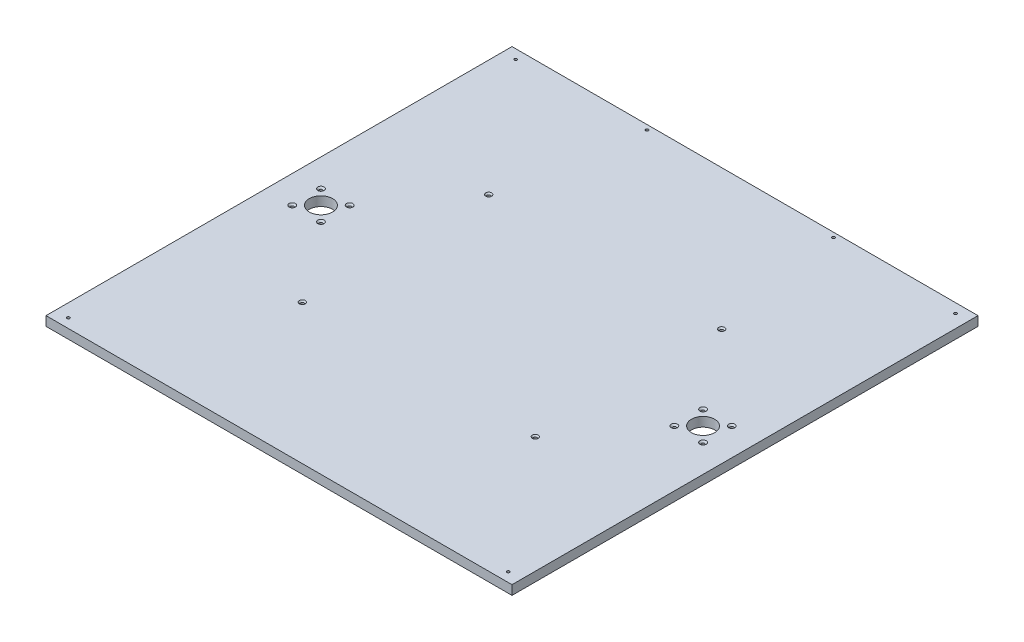
ISO-10303-21;
HEADER;
FILE_DESCRIPTION(('STEP AP214'),'2;1');
FILE_NAME('part.step','',(''),(''),'','','');
FILE_SCHEMA(('AUTOMOTIVE_DESIGN { 1 0 10303 214 1 1 1 1 }'));
ENDSEC;
DATA;
#1=APPLICATION_CONTEXT('core data for automotive mechanical design processes');
#2=APPLICATION_PROTOCOL_DEFINITION('international standard','automotive_design',2000,#1);
#3=PRODUCT_CONTEXT('',#1,'mechanical');
#4=PRODUCT('Part','Part','',(#3));
#5=PRODUCT_RELATED_PRODUCT_CATEGORY('part','',(#4));
#6=PRODUCT_DEFINITION_FORMATION('','',#4);
#7=PRODUCT_DEFINITION_CONTEXT('part definition',#1,'design');
#8=PRODUCT_DEFINITION('design','',#6,#7);
#9=PRODUCT_DEFINITION_SHAPE('','',#8);
#10=(LENGTH_UNIT() NAMED_UNIT(*) SI_UNIT(.MILLI.,.METRE.));
#11=(NAMED_UNIT(*) PLANE_ANGLE_UNIT() SI_UNIT($,.RADIAN.));
#12=(NAMED_UNIT(*) SI_UNIT($,.STERADIAN.) SOLID_ANGLE_UNIT());
#13=UNCERTAINTY_MEASURE_WITH_UNIT(LENGTH_MEASURE(1.E-05),#10,'distance_accuracy_value','');
#14=(GEOMETRIC_REPRESENTATION_CONTEXT(3) GLOBAL_UNCERTAINTY_ASSIGNED_CONTEXT((#13)) GLOBAL_UNIT_ASSIGNED_CONTEXT((#10,
#11,#12)) REPRESENTATION_CONTEXT('',''));
#15=CARTESIAN_POINT('',(0.,0.,0.));
#16=DIRECTION('',(0.,0.,1.));
#17=DIRECTION('',(1.,0.,0.));
#18=AXIS2_PLACEMENT_3D('',#15,#16,#17);
#19=CARTESIAN_POINT('',(0.,10.,0.));
#20=DIRECTION('',(1.,0.,0.));
#21=DIRECTION('',(0.,0.,-1.));
#22=AXIS2_PLACEMENT_3D('',#19,#20,#21);
#23=PLANE('',#22);
#24=DIRECTION('',(0.,0.,1.));
#25=VECTOR('',#24,1.);
#26=CARTESIAN_POINT('',(0.,0.,0.));
#27=LINE('',#26,#25);
#28=CARTESIAN_POINT('',(0.,0.,-500.));
#29=VERTEX_POINT('',#28);
#30=CARTESIAN_POINT('',(0.,0.,0.));
#31=VERTEX_POINT('',#30);
#32=EDGE_CURVE('E106',#29,#31,#27,.T.);
#33=ORIENTED_EDGE('',*,*,#32,.T.);
#34=DIRECTION('',(0.,-1.,0.));
#35=VECTOR('',#34,1.);
#36=CARTESIAN_POINT('',(0.,10.,0.));
#37=LINE('',#36,#35);
#38=CARTESIAN_POINT('',(0.,10.,0.));
#39=VERTEX_POINT('',#38);
#40=EDGE_CURVE('E11',#39,#31,#37,.T.);
#41=ORIENTED_EDGE('',*,*,#40,.F.);
#42=DIRECTION('',(0.,0.,1.));
#43=VECTOR('',#42,1.);
#44=CARTESIAN_POINT('',(0.,10.,0.));
#45=LINE('',#44,#43);
#46=CARTESIAN_POINT('',(0.,10.,-500.));
#47=VERTEX_POINT('',#46);
#48=EDGE_CURVE('E94',#47,#39,#45,.T.);
#49=ORIENTED_EDGE('',*,*,#48,.F.);
#50=DIRECTION('',(0.,-1.,0.));
#51=VECTOR('',#50,1.);
#52=CARTESIAN_POINT('',(0.,10.,-500.));
#53=LINE('',#52,#51);
#54=EDGE_CURVE('E102',#47,#29,#53,.T.);
#55=ORIENTED_EDGE('',*,*,#54,.T.);
#56=EDGE_LOOP('',(#33,#41,#49,#55));
#57=FACE_BOUND('',#56,.T.);
#58=ADVANCED_FACE('F43',(#57),#23,.F.);
#59=CARTESIAN_POINT('',(0.,10.,0.));
#60=DIRECTION('',(0.,0.,-1.));
#61=DIRECTION('',(-1.,0.,0.));
#62=AXIS2_PLACEMENT_3D('',#59,#60,#61);
#63=PLANE('',#62);
#64=DIRECTION('',(1.,0.,0.));
#65=VECTOR('',#64,1.);
#66=CARTESIAN_POINT('',(0.,0.,0.));
#67=LINE('',#66,#65);
#68=CARTESIAN_POINT('',(500.,0.,0.));
#69=VERTEX_POINT('',#68);
#70=EDGE_CURVE('E98',#31,#69,#67,.T.);
#71=ORIENTED_EDGE('',*,*,#70,.T.);
#72=DIRECTION('',(0.,-1.,0.));
#73=VECTOR('',#72,1.);
#74=CARTESIAN_POINT('',(500.,10.,0.));
#75=LINE('',#74,#73);
#76=CARTESIAN_POINT('',(500.,10.,0.));
#77=VERTEX_POINT('',#76);
#78=EDGE_CURVE('E51',#77,#69,#75,.T.);
#79=ORIENTED_EDGE('',*,*,#78,.F.);
#80=DIRECTION('',(1.,0.,0.));
#81=VECTOR('',#80,1.);
#82=CARTESIAN_POINT('',(0.,10.,0.));
#83=LINE('',#82,#81);
#84=EDGE_CURVE('E89',#39,#77,#83,.T.);
#85=ORIENTED_EDGE('',*,*,#84,.F.);
#86=ORIENTED_EDGE('',*,*,#40,.T.);
#87=EDGE_LOOP('',(#71,#79,#85,#86));
#88=FACE_BOUND('',#87,.T.);
#89=ADVANCED_FACE('F97',(#88),#63,.F.);
#90=CARTESIAN_POINT('',(500.,10.,0.));
#91=DIRECTION('',(-1.,0.,0.));
#92=DIRECTION('',(0.,0.,1.));
#93=AXIS2_PLACEMENT_3D('',#90,#91,#92);
#94=PLANE('',#93);
#95=DIRECTION('',(0.,0.,-1.));
#96=VECTOR('',#95,1.);
#97=CARTESIAN_POINT('',(500.,0.,0.));
#98=LINE('',#97,#96);
#99=CARTESIAN_POINT('',(500.,0.,-500.));
#100=VERTEX_POINT('',#99);
#101=EDGE_CURVE('E76',#69,#100,#98,.T.);
#102=ORIENTED_EDGE('',*,*,#101,.T.);
#103=DIRECTION('',(0.,-1.,0.));
#104=VECTOR('',#103,1.);
#105=CARTESIAN_POINT('',(500.,10.,-500.));
#106=LINE('',#105,#104);
#107=CARTESIAN_POINT('',(500.,10.,-500.));
#108=VERTEX_POINT('',#107);
#109=EDGE_CURVE('E99',#108,#100,#106,.T.);
#110=ORIENTED_EDGE('',*,*,#109,.F.);
#111=DIRECTION('',(0.,0.,-1.));
#112=VECTOR('',#111,1.);
#113=CARTESIAN_POINT('',(500.,10.,0.));
#114=LINE('',#113,#112);
#115=EDGE_CURVE('E92',#77,#108,#114,.T.);
#116=ORIENTED_EDGE('',*,*,#115,.F.);
#117=ORIENTED_EDGE('',*,*,#78,.T.);
#118=EDGE_LOOP('',(#102,#110,#116,#117));
#119=FACE_BOUND('',#118,.T.);
#120=ADVANCED_FACE('F100',(#119),#94,.F.);
#121=CARTESIAN_POINT('',(0.,10.,-500.));
#122=DIRECTION('',(0.,0.,1.));
#123=DIRECTION('',(1.,0.,0.));
#124=AXIS2_PLACEMENT_3D('',#121,#122,#123);
#125=PLANE('',#124);
#126=DIRECTION('',(-1.,0.,0.));
#127=VECTOR('',#126,1.);
#128=CARTESIAN_POINT('',(0.,0.,-500.));
#129=LINE('',#128,#127);
#130=EDGE_CURVE('E82',#100,#29,#129,.T.);
#131=ORIENTED_EDGE('',*,*,#130,.T.);
#132=ORIENTED_EDGE('',*,*,#54,.F.);
#133=DIRECTION('',(-1.,0.,0.));
#134=VECTOR('',#133,1.);
#135=CARTESIAN_POINT('',(0.,10.,-500.));
#136=LINE('',#135,#134);
#137=EDGE_CURVE('E59',#108,#47,#136,.T.);
#138=ORIENTED_EDGE('',*,*,#137,.F.);
#139=ORIENTED_EDGE('',*,*,#109,.T.);
#140=EDGE_LOOP('',(#131,#132,#138,#139));
#141=FACE_BOUND('',#140,.T.);
#142=ADVANCED_FACE('F114',(#141),#125,.F.);
#143=CARTESIAN_POINT('',(0.,10.,0.));
#144=DIRECTION('',(0.,-1.,0.));
#145=DIRECTION('',(0.,0.,-1.));
#146=AXIS2_PLACEMENT_3D('',#143,#144,#145);
#147=PLANE('',#146);
#148=CARTESIAN_POINT('',(150.,9.99999999999999,-495.));
#149=DIRECTION('',(0.,-1.,0.));
#150=DIRECTION('',(0.,0.,-1.));
#151=AXIS2_PLACEMENT_3D('',#148,#149,#150);
#152=CIRCLE('',#151,1.5);
#153=CARTESIAN_POINT('',(150.,9.99999999999999,-496.5));
#154=VERTEX_POINT('',#153);
#155=EDGE_CURVE('E269',#154,#154,#152,.T.);
#156=ORIENTED_EDGE('',*,*,#155,.T.);
#157=EDGE_LOOP('',(#156));
#158=FACE_BOUND('',#157,.T.);
#159=CARTESIAN_POINT('',(350.,9.99999999999999,-495.));
#160=DIRECTION('',(0.,-1.,0.));
#161=DIRECTION('',(0.,0.,-1.));
#162=AXIS2_PLACEMENT_3D('',#159,#160,#161);
#163=CIRCLE('',#162,1.5);
#164=CARTESIAN_POINT('',(350.,9.99999999999999,-496.5));
#165=VERTEX_POINT('',#164);
#166=EDGE_CURVE('E263',#165,#165,#163,.T.);
#167=ORIENTED_EDGE('',*,*,#166,.T.);
#168=EDGE_LOOP('',(#167));
#169=FACE_BOUND('',#168,.T.);
#170=CARTESIAN_POINT('',(485.999999999998,10.,-490.));
#171=DIRECTION('',(0.,-1.,0.));
#172=DIRECTION('',(0.,0.,-1.));
#173=AXIS2_PLACEMENT_3D('',#170,#171,#172);
#174=CIRCLE('',#173,1.5);
#175=CARTESIAN_POINT('',(485.999999999998,10.,-491.5));
#176=VERTEX_POINT('',#175);
#177=EDGE_CURVE('E257',#176,#176,#174,.T.);
#178=ORIENTED_EDGE('',*,*,#177,.T.);
#179=EDGE_LOOP('',(#178));
#180=FACE_BOUND('',#179,.T.);
#181=CARTESIAN_POINT('',(485.999999999998,10.,-10.));
#182=DIRECTION('',(0.,-1.,0.));
#183=DIRECTION('',(0.,0.,-1.));
#184=AXIS2_PLACEMENT_3D('',#181,#182,#183);
#185=CIRCLE('',#184,1.5);
#186=CARTESIAN_POINT('',(485.999999999998,10.,-11.5));
#187=VERTEX_POINT('',#186);
#188=EDGE_CURVE('E251',#187,#187,#185,.T.);
#189=ORIENTED_EDGE('',*,*,#188,.T.);
#190=EDGE_LOOP('',(#189));
#191=FACE_BOUND('',#190,.T.);
#192=CARTESIAN_POINT('',(14.0000000000014,10.,-10.));
#193=DIRECTION('',(0.,-1.,0.));
#194=DIRECTION('',(0.,0.,-1.));
#195=AXIS2_PLACEMENT_3D('',#192,#193,#194);
#196=CIRCLE('',#195,1.5);
#197=CARTESIAN_POINT('',(14.0000000000014,10.,-11.5));
#198=VERTEX_POINT('',#197);
#199=EDGE_CURVE('E245',#198,#198,#196,.T.);
#200=ORIENTED_EDGE('',*,*,#199,.T.);
#201=EDGE_LOOP('',(#200));
#202=FACE_BOUND('',#201,.T.);
#203=CARTESIAN_POINT('',(14.0000000000014,10.,-490.));
#204=DIRECTION('',(0.,-1.,0.));
#205=DIRECTION('',(0.,0.,-1.));
#206=AXIS2_PLACEMENT_3D('',#203,#204,#205);
#207=CIRCLE('',#206,1.5);
#208=CARTESIAN_POINT('',(14.0000000000014,10.,-491.5));
#209=VERTEX_POINT('',#208);
#210=EDGE_CURVE('E239',#209,#209,#207,.T.);
#211=ORIENTED_EDGE('',*,*,#210,.T.);
#212=EDGE_LOOP('',(#211));
#213=FACE_BOUND('',#212,.T.);
#214=CARTESIAN_POINT('',(374.999999999999,10.,-350.));
#215=DIRECTION('',(0.,1.,0.));
#216=DIRECTION('',(0.,0.,1.));
#217=AXIS2_PLACEMENT_3D('',#214,#215,#216);
#218=CIRCLE('',#217,3.14999999999999);
#219=CARTESIAN_POINT('',(374.999999999999,10.,-346.85));
#220=VERTEX_POINT('',#219);
#221=EDGE_CURVE('E236',#220,#220,#218,.T.);
#222=ORIENTED_EDGE('',*,*,#221,.F.);
#223=EDGE_LOOP('',(#222));
#224=FACE_BOUND('',#223,.T.);
#225=CARTESIAN_POINT('',(375.,10.,-150.));
#226=DIRECTION('',(0.,1.,0.));
#227=DIRECTION('',(0.,0.,1.));
#228=AXIS2_PLACEMENT_3D('',#225,#226,#227);
#229=CIRCLE('',#228,3.14999999999999);
#230=CARTESIAN_POINT('',(375.,10.,-146.85));
#231=VERTEX_POINT('',#230);
#232=EDGE_CURVE('E227',#231,#231,#229,.T.);
#233=ORIENTED_EDGE('',*,*,#232,.F.);
#234=EDGE_LOOP('',(#233));
#235=FACE_BOUND('',#234,.T.);
#236=CARTESIAN_POINT('',(124.999999999999,10.,-350.));
#237=DIRECTION('',(0.,1.,0.));
#238=DIRECTION('',(0.,0.,1.));
#239=AXIS2_PLACEMENT_3D('',#236,#237,#238);
#240=CIRCLE('',#239,3.15);
#241=CARTESIAN_POINT('',(124.999999999999,10.,-346.85));
#242=VERTEX_POINT('',#241);
#243=EDGE_CURVE('E218',#242,#242,#240,.T.);
#244=ORIENTED_EDGE('',*,*,#243,.F.);
#245=EDGE_LOOP('',(#244));
#246=FACE_BOUND('',#245,.T.);
#247=CARTESIAN_POINT('',(125.,10.,-150.));
#248=DIRECTION('',(0.,1.,0.));
#249=DIRECTION('',(0.,0.,1.));
#250=AXIS2_PLACEMENT_3D('',#247,#248,#249);
#251=CIRCLE('',#250,3.14999999999999);
#252=CARTESIAN_POINT('',(125.,10.,-146.85));
#253=VERTEX_POINT('',#252);
#254=EDGE_CURVE('E209',#253,#253,#251,.T.);
#255=ORIENTED_EDGE('',*,*,#254,.F.);
#256=EDGE_LOOP('',(#255));
#257=FACE_BOUND('',#256,.T.);
#258=CARTESIAN_POINT('',(439.6,10.,-265.4));
#259=DIRECTION('',(0.,1.,0.));
#260=DIRECTION('',(0.,0.,1.));
#261=AXIS2_PLACEMENT_3D('',#258,#259,#260);
#262=CIRCLE('',#261,3.35999999999997);
#263=CARTESIAN_POINT('',(439.6,10.,-262.04));
#264=VERTEX_POINT('',#263);
#265=EDGE_CURVE('E200',#264,#264,#262,.T.);
#266=ORIENTED_EDGE('',*,*,#265,.F.);
#267=EDGE_LOOP('',(#266));
#268=FACE_BOUND('',#267,.T.);
#269=CARTESIAN_POINT('',(439.6,10.,-234.6));
#270=DIRECTION('',(0.,1.,0.));
#271=DIRECTION('',(0.,0.,1.));
#272=AXIS2_PLACEMENT_3D('',#269,#270,#271);
#273=CIRCLE('',#272,3.35999999999997);
#274=CARTESIAN_POINT('',(439.6,10.,-231.24));
#275=VERTEX_POINT('',#274);
#276=EDGE_CURVE('E191',#275,#275,#273,.T.);
#277=ORIENTED_EDGE('',*,*,#276,.F.);
#278=EDGE_LOOP('',(#277));
#279=FACE_BOUND('',#278,.T.);
#280=CARTESIAN_POINT('',(470.4,10.,-234.6));
#281=DIRECTION('',(0.,1.,0.));
#282=DIRECTION('',(0.,0.,1.));
#283=AXIS2_PLACEMENT_3D('',#280,#281,#282);
#284=CIRCLE('',#283,3.35999999999997);
#285=CARTESIAN_POINT('',(470.4,10.,-231.24));
#286=VERTEX_POINT('',#285);
#287=EDGE_CURVE('E182',#286,#286,#284,.T.);
#288=ORIENTED_EDGE('',*,*,#287,.F.);
#289=EDGE_LOOP('',(#288));
#290=FACE_BOUND('',#289,.T.);
#291=CARTESIAN_POINT('',(470.4,10.,-265.4));
#292=DIRECTION('',(0.,1.,0.));
#293=DIRECTION('',(0.,0.,1.));
#294=AXIS2_PLACEMENT_3D('',#291,#292,#293);
#295=CIRCLE('',#294,3.35999999999997);
#296=CARTESIAN_POINT('',(470.4,10.,-262.04));
#297=VERTEX_POINT('',#296);
#298=EDGE_CURVE('E173',#297,#297,#295,.T.);
#299=ORIENTED_EDGE('',*,*,#298,.F.);
#300=EDGE_LOOP('',(#299));
#301=FACE_BOUND('',#300,.T.);
#302=CARTESIAN_POINT('',(60.4,10.,-234.6));
#303=DIRECTION('',(0.,1.,0.));
#304=DIRECTION('',(0.,0.,1.));
#305=AXIS2_PLACEMENT_3D('',#302,#303,#304);
#306=CIRCLE('',#305,3.36);
#307=CARTESIAN_POINT('',(60.4,10.,-231.24));
#308=VERTEX_POINT('',#307);
#309=EDGE_CURVE('E164',#308,#308,#306,.T.);
#310=ORIENTED_EDGE('',*,*,#309,.F.);
#311=EDGE_LOOP('',(#310));
#312=FACE_BOUND('',#311,.T.);
#313=CARTESIAN_POINT('',(60.4,10.,-265.4));
#314=DIRECTION('',(0.,1.,0.));
#315=DIRECTION('',(0.,0.,1.));
#316=AXIS2_PLACEMENT_3D('',#313,#314,#315);
#317=CIRCLE('',#316,3.36);
#318=CARTESIAN_POINT('',(60.4,10.,-262.04));
#319=VERTEX_POINT('',#318);
#320=EDGE_CURVE('E155',#319,#319,#317,.T.);
#321=ORIENTED_EDGE('',*,*,#320,.F.);
#322=EDGE_LOOP('',(#321));
#323=FACE_BOUND('',#322,.T.);
#324=CARTESIAN_POINT('',(29.6,10.,-234.6));
#325=DIRECTION('',(0.,1.,0.));
#326=DIRECTION('',(0.,0.,1.));
#327=AXIS2_PLACEMENT_3D('',#324,#325,#326);
#328=CIRCLE('',#327,3.36);
#329=CARTESIAN_POINT('',(29.6,10.,-231.24));
#330=VERTEX_POINT('',#329);
#331=EDGE_CURVE('E146',#330,#330,#328,.T.);
#332=ORIENTED_EDGE('',*,*,#331,.F.);
#333=EDGE_LOOP('',(#332));
#334=FACE_BOUND('',#333,.T.);
#335=CARTESIAN_POINT('',(29.6,10.,-265.4));
#336=DIRECTION('',(0.,1.,0.));
#337=DIRECTION('',(0.,0.,1.));
#338=AXIS2_PLACEMENT_3D('',#335,#336,#337);
#339=CIRCLE('',#338,3.36);
#340=CARTESIAN_POINT('',(29.6,10.,-262.04));
#341=VERTEX_POINT('',#340);
#342=EDGE_CURVE('E137',#341,#341,#339,.T.);
#343=ORIENTED_EDGE('',*,*,#342,.F.);
#344=EDGE_LOOP('',(#343));
#345=FACE_BOUND('',#344,.T.);
#346=CARTESIAN_POINT('',(45.,10.,-250.));
#347=DIRECTION('',(0.,1.,0.));
#348=DIRECTION('',(0.,0.,1.));
#349=AXIS2_PLACEMENT_3D('',#346,#347,#348);
#350=CIRCLE('',#349,12.5);
#351=CARTESIAN_POINT('',(45.,10.,-237.5));
#352=VERTEX_POINT('',#351);
#353=EDGE_CURVE('E127',#352,#352,#350,.T.);
#354=ORIENTED_EDGE('',*,*,#353,.F.);
#355=EDGE_LOOP('',(#354));
#356=FACE_BOUND('',#355,.T.);
#357=CARTESIAN_POINT('',(455.,10.,-250.));
#358=DIRECTION('',(0.,1.,0.));
#359=DIRECTION('',(0.,0.,1.));
#360=AXIS2_PLACEMENT_3D('',#357,#358,#359);
#361=CIRCLE('',#360,12.5);
#362=CARTESIAN_POINT('',(455.,10.,-237.5));
#363=VERTEX_POINT('',#362);
#364=EDGE_CURVE('E120',#363,#363,#361,.T.);
#365=ORIENTED_EDGE('',*,*,#364,.F.);
#366=EDGE_LOOP('',(#365));
#367=FACE_BOUND('',#366,.T.);
#368=ORIENTED_EDGE('',*,*,#48,.T.);
#369=ORIENTED_EDGE('',*,*,#84,.T.);
#370=ORIENTED_EDGE('',*,*,#115,.T.);
#371=ORIENTED_EDGE('',*,*,#137,.T.);
#372=EDGE_LOOP('',(#368,#369,#370,#371));
#373=FACE_BOUND('',#372,.T.);
#374=ADVANCED_FACE('F90',(#158,#169,#180,#191,#202,#213,#224,#235,#246,#257,#268,#279,#290,#301,
#312,#323,#334,#345,#356,#367,#373),#147,.F.);
#375=CARTESIAN_POINT('',(0.,0.,0.));
#376=DIRECTION('',(0.,-1.,0.));
#377=DIRECTION('',(0.,0.,-1.));
#378=AXIS2_PLACEMENT_3D('',#375,#376,#377);
#379=PLANE('',#378);
#380=CARTESIAN_POINT('',(150.,0.,-495.));
#381=DIRECTION('',(0.,-1.,0.));
#382=DIRECTION('',(0.,0.,-1.));
#383=AXIS2_PLACEMENT_3D('',#380,#381,#382);
#384=CIRCLE('',#383,1.5);
#385=CARTESIAN_POINT('',(150.,0.,-496.5));
#386=VERTEX_POINT('',#385);
#387=EDGE_CURVE('E272',#386,#386,#384,.T.);
#388=ORIENTED_EDGE('',*,*,#387,.F.);
#389=EDGE_LOOP('',(#388));
#390=FACE_BOUND('',#389,.T.);
#391=CARTESIAN_POINT('',(350.,0.,-495.));
#392=DIRECTION('',(0.,-1.,0.));
#393=DIRECTION('',(0.,0.,-1.));
#394=AXIS2_PLACEMENT_3D('',#391,#392,#393);
#395=CIRCLE('',#394,1.5);
#396=CARTESIAN_POINT('',(350.,0.,-496.5));
#397=VERTEX_POINT('',#396);
#398=EDGE_CURVE('E266',#397,#397,#395,.T.);
#399=ORIENTED_EDGE('',*,*,#398,.F.);
#400=EDGE_LOOP('',(#399));
#401=FACE_BOUND('',#400,.T.);
#402=CARTESIAN_POINT('',(485.999999999998,0.,-490.));
#403=DIRECTION('',(0.,-1.,0.));
#404=DIRECTION('',(0.,0.,-1.));
#405=AXIS2_PLACEMENT_3D('',#402,#403,#404);
#406=CIRCLE('',#405,1.5);
#407=CARTESIAN_POINT('',(485.999999999998,0.,-491.5));
#408=VERTEX_POINT('',#407);
#409=EDGE_CURVE('E260',#408,#408,#406,.T.);
#410=ORIENTED_EDGE('',*,*,#409,.F.);
#411=EDGE_LOOP('',(#410));
#412=FACE_BOUND('',#411,.T.);
#413=CARTESIAN_POINT('',(485.999999999998,0.,-10.));
#414=DIRECTION('',(0.,-1.,0.));
#415=DIRECTION('',(0.,0.,-1.));
#416=AXIS2_PLACEMENT_3D('',#413,#414,#415);
#417=CIRCLE('',#416,1.5);
#418=CARTESIAN_POINT('',(485.999999999998,0.,-11.5));
#419=VERTEX_POINT('',#418);
#420=EDGE_CURVE('E254',#419,#419,#417,.T.);
#421=ORIENTED_EDGE('',*,*,#420,.F.);
#422=EDGE_LOOP('',(#421));
#423=FACE_BOUND('',#422,.T.);
#424=CARTESIAN_POINT('',(14.0000000000014,0.,-10.));
#425=DIRECTION('',(0.,-1.,0.));
#426=DIRECTION('',(0.,0.,-1.));
#427=AXIS2_PLACEMENT_3D('',#424,#425,#426);
#428=CIRCLE('',#427,1.5);
#429=CARTESIAN_POINT('',(14.0000000000014,0.,-11.5));
#430=VERTEX_POINT('',#429);
#431=EDGE_CURVE('E248',#430,#430,#428,.T.);
#432=ORIENTED_EDGE('',*,*,#431,.F.);
#433=EDGE_LOOP('',(#432));
#434=FACE_BOUND('',#433,.T.);
#435=CARTESIAN_POINT('',(14.0000000000014,0.,-490.));
#436=DIRECTION('',(0.,-1.,0.));
#437=DIRECTION('',(0.,0.,-1.));
#438=AXIS2_PLACEMENT_3D('',#435,#436,#437);
#439=CIRCLE('',#438,1.5);
#440=CARTESIAN_POINT('',(14.0000000000014,0.,-491.5));
#441=VERTEX_POINT('',#440);
#442=EDGE_CURVE('E242',#441,#441,#439,.T.);
#443=ORIENTED_EDGE('',*,*,#442,.F.);
#444=EDGE_LOOP('',(#443));
#445=FACE_BOUND('',#444,.T.);
#446=CARTESIAN_POINT('',(374.999999999999,0.,-350.));
#447=DIRECTION('',(0.,1.,0.));
#448=DIRECTION('',(0.,0.,1.));
#449=AXIS2_PLACEMENT_3D('',#446,#447,#448);
#450=CIRCLE('',#449,1.69999999999998);
#451=CARTESIAN_POINT('',(374.999999999999,0.,-348.3));
#452=VERTEX_POINT('',#451);
#453=EDGE_CURVE('E230',#452,#452,#450,.T.);
#454=ORIENTED_EDGE('',*,*,#453,.T.);
#455=EDGE_LOOP('',(#454));
#456=FACE_BOUND('',#455,.T.);
#457=CARTESIAN_POINT('',(375.,0.,-150.));
#458=DIRECTION('',(0.,1.,0.));
#459=DIRECTION('',(0.,0.,1.));
#460=AXIS2_PLACEMENT_3D('',#457,#458,#459);
#461=CIRCLE('',#460,1.69999999999998);
#462=CARTESIAN_POINT('',(375.,0.,-148.3));
#463=VERTEX_POINT('',#462);
#464=EDGE_CURVE('E221',#463,#463,#461,.T.);
#465=ORIENTED_EDGE('',*,*,#464,.T.);
#466=EDGE_LOOP('',(#465));
#467=FACE_BOUND('',#466,.T.);
#468=CARTESIAN_POINT('',(124.999999999999,0.,-350.));
#469=DIRECTION('',(0.,1.,0.));
#470=DIRECTION('',(0.,0.,1.));
#471=AXIS2_PLACEMENT_3D('',#468,#469,#470);
#472=CIRCLE('',#471,1.69999999999999);
#473=CARTESIAN_POINT('',(124.999999999999,0.,-348.3));
#474=VERTEX_POINT('',#473);
#475=EDGE_CURVE('E212',#474,#474,#472,.T.);
#476=ORIENTED_EDGE('',*,*,#475,.T.);
#477=EDGE_LOOP('',(#476));
#478=FACE_BOUND('',#477,.T.);
#479=CARTESIAN_POINT('',(125.,0.,-150.));
#480=DIRECTION('',(0.,1.,0.));
#481=DIRECTION('',(0.,0.,1.));
#482=AXIS2_PLACEMENT_3D('',#479,#480,#481);
#483=CIRCLE('',#482,1.70000000000001);
#484=CARTESIAN_POINT('',(125.,0.,-148.3));
#485=VERTEX_POINT('',#484);
#486=EDGE_CURVE('E203',#485,#485,#483,.T.);
#487=ORIENTED_EDGE('',*,*,#486,.T.);
#488=EDGE_LOOP('',(#487));
#489=FACE_BOUND('',#488,.T.);
#490=CARTESIAN_POINT('',(439.6,0.,-265.4));
#491=DIRECTION('',(0.,1.,0.));
#492=DIRECTION('',(0.,0.,1.));
#493=AXIS2_PLACEMENT_3D('',#490,#491,#492);
#494=CIRCLE('',#493,1.69999999999998);
#495=CARTESIAN_POINT('',(439.6,0.,-263.7));
#496=VERTEX_POINT('',#495);
#497=EDGE_CURVE('E194',#496,#496,#494,.T.);
#498=ORIENTED_EDGE('',*,*,#497,.T.);
#499=EDGE_LOOP('',(#498));
#500=FACE_BOUND('',#499,.T.);
#501=CARTESIAN_POINT('',(439.6,0.,-234.6));
#502=DIRECTION('',(0.,1.,0.));
#503=DIRECTION('',(0.,0.,1.));
#504=AXIS2_PLACEMENT_3D('',#501,#502,#503);
#505=CIRCLE('',#504,1.69999999999998);
#506=CARTESIAN_POINT('',(439.6,0.,-232.9));
#507=VERTEX_POINT('',#506);
#508=EDGE_CURVE('E185',#507,#507,#505,.T.);
#509=ORIENTED_EDGE('',*,*,#508,.T.);
#510=EDGE_LOOP('',(#509));
#511=FACE_BOUND('',#510,.T.);
#512=CARTESIAN_POINT('',(470.4,0.,-234.6));
#513=DIRECTION('',(0.,1.,0.));
#514=DIRECTION('',(0.,0.,1.));
#515=AXIS2_PLACEMENT_3D('',#512,#513,#514);
#516=CIRCLE('',#515,1.69999999999998);
#517=CARTESIAN_POINT('',(470.4,0.,-232.9));
#518=VERTEX_POINT('',#517);
#519=EDGE_CURVE('E176',#518,#518,#516,.T.);
#520=ORIENTED_EDGE('',*,*,#519,.T.);
#521=EDGE_LOOP('',(#520));
#522=FACE_BOUND('',#521,.T.);
#523=CARTESIAN_POINT('',(470.4,0.,-265.4));
#524=DIRECTION('',(0.,1.,0.));
#525=DIRECTION('',(0.,0.,1.));
#526=AXIS2_PLACEMENT_3D('',#523,#524,#525);
#527=CIRCLE('',#526,1.69999999999998);
#528=CARTESIAN_POINT('',(470.4,0.,-263.7));
#529=VERTEX_POINT('',#528);
#530=EDGE_CURVE('E167',#529,#529,#527,.T.);
#531=ORIENTED_EDGE('',*,*,#530,.T.);
#532=EDGE_LOOP('',(#531));
#533=FACE_BOUND('',#532,.T.);
#534=CARTESIAN_POINT('',(60.4,0.,-234.6));
#535=DIRECTION('',(0.,1.,0.));
#536=DIRECTION('',(0.,0.,1.));
#537=AXIS2_PLACEMENT_3D('',#534,#535,#536);
#538=CIRCLE('',#537,1.7);
#539=CARTESIAN_POINT('',(60.4,0.,-232.9));
#540=VERTEX_POINT('',#539);
#541=EDGE_CURVE('E158',#540,#540,#538,.T.);
#542=ORIENTED_EDGE('',*,*,#541,.T.);
#543=EDGE_LOOP('',(#542));
#544=FACE_BOUND('',#543,.T.);
#545=CARTESIAN_POINT('',(60.4,0.,-265.4));
#546=DIRECTION('',(0.,1.,0.));
#547=DIRECTION('',(0.,0.,1.));
#548=AXIS2_PLACEMENT_3D('',#545,#546,#547);
#549=CIRCLE('',#548,1.7);
#550=CARTESIAN_POINT('',(60.4,0.,-263.7));
#551=VERTEX_POINT('',#550);
#552=EDGE_CURVE('E149',#551,#551,#549,.T.);
#553=ORIENTED_EDGE('',*,*,#552,.T.);
#554=EDGE_LOOP('',(#553));
#555=FACE_BOUND('',#554,.T.);
#556=CARTESIAN_POINT('',(29.6,0.,-234.6));
#557=DIRECTION('',(0.,1.,0.));
#558=DIRECTION('',(0.,0.,1.));
#559=AXIS2_PLACEMENT_3D('',#556,#557,#558);
#560=CIRCLE('',#559,1.7);
#561=CARTESIAN_POINT('',(29.6,0.,-232.9));
#562=VERTEX_POINT('',#561);
#563=EDGE_CURVE('E140',#562,#562,#560,.T.);
#564=ORIENTED_EDGE('',*,*,#563,.T.);
#565=EDGE_LOOP('',(#564));
#566=FACE_BOUND('',#565,.T.);
#567=CARTESIAN_POINT('',(29.6,0.,-265.4));
#568=DIRECTION('',(0.,1.,0.));
#569=DIRECTION('',(0.,0.,1.));
#570=AXIS2_PLACEMENT_3D('',#567,#568,#569);
#571=CIRCLE('',#570,1.7);
#572=CARTESIAN_POINT('',(29.6,0.,-263.7));
#573=VERTEX_POINT('',#572);
#574=EDGE_CURVE('E124',#573,#573,#571,.T.);
#575=ORIENTED_EDGE('',*,*,#574,.T.);
#576=EDGE_LOOP('',(#575));
#577=FACE_BOUND('',#576,.T.);
#578=CARTESIAN_POINT('',(45.,0.,-250.));
#579=DIRECTION('',(0.,1.,0.));
#580=DIRECTION('',(0.,0.,1.));
#581=AXIS2_PLACEMENT_3D('',#578,#579,#580);
#582=CIRCLE('',#581,12.5);
#583=CARTESIAN_POINT('',(45.,0.,-237.5));
#584=VERTEX_POINT('',#583);
#585=EDGE_CURVE('E109',#584,#584,#582,.T.);
#586=ORIENTED_EDGE('',*,*,#585,.T.);
#587=EDGE_LOOP('',(#586));
#588=FACE_BOUND('',#587,.T.);
#589=CARTESIAN_POINT('',(455.,0.,-250.));
#590=DIRECTION('',(0.,1.,0.));
#591=DIRECTION('',(0.,0.,1.));
#592=AXIS2_PLACEMENT_3D('',#589,#590,#591);
#593=CIRCLE('',#592,12.5);
#594=CARTESIAN_POINT('',(455.,0.,-237.5));
#595=VERTEX_POINT('',#594);
#596=EDGE_CURVE('E123',#595,#595,#593,.T.);
#597=ORIENTED_EDGE('',*,*,#596,.T.);
#598=EDGE_LOOP('',(#597));
#599=FACE_BOUND('',#598,.T.);
#600=ORIENTED_EDGE('',*,*,#32,.F.);
#601=ORIENTED_EDGE('',*,*,#130,.F.);
#602=ORIENTED_EDGE('',*,*,#101,.F.);
#603=ORIENTED_EDGE('',*,*,#70,.F.);
#604=EDGE_LOOP('',(#600,#601,#602,#603));
#605=FACE_BOUND('',#604,.T.);
#606=ADVANCED_FACE('F117',(#390,#401,#412,#423,#434,#445,#456,#467,#478,#489,#500,#511,#522,
#533,#544,#555,#566,#577,#588,#599,#605),#379,.T.);
#607=CARTESIAN_POINT('',(455.,0.,-250.));
#608=DIRECTION('',(0.,1.,0.));
#609=DIRECTION('',(0.,0.,1.));
#610=AXIS2_PLACEMENT_3D('',#607,#608,#609);
#611=CYLINDRICAL_SURFACE('',#610,12.5);
#612=ORIENTED_EDGE('',*,*,#596,.F.);
#613=EDGE_LOOP('',(#612));
#614=FACE_BOUND('',#613,.T.);
#615=ORIENTED_EDGE('',*,*,#364,.T.);
#616=EDGE_LOOP('',(#615));
#617=FACE_BOUND('',#616,.T.);
#618=ADVANCED_FACE('F280',(#614,#617),#611,.F.);
#619=CARTESIAN_POINT('',(45.,0.,-250.));
#620=DIRECTION('',(0.,1.,0.));
#621=DIRECTION('',(0.,0.,1.));
#622=AXIS2_PLACEMENT_3D('',#619,#620,#621);
#623=CYLINDRICAL_SURFACE('',#622,12.5);
#624=ORIENTED_EDGE('',*,*,#585,.F.);
#625=EDGE_LOOP('',(#624));
#626=FACE_BOUND('',#625,.T.);
#627=ORIENTED_EDGE('',*,*,#353,.T.);
#628=EDGE_LOOP('',(#627));
#629=FACE_BOUND('',#628,.T.);
#630=ADVANCED_FACE('F322',(#626,#629),#623,.F.);
#631=CARTESIAN_POINT('',(29.6,10.,-265.4));
#632=DIRECTION('',(0.,1.,0.));
#633=DIRECTION('',(0.,0.,1.));
#634=AXIS2_PLACEMENT_3D('',#631,#632,#633);
#635=CYLINDRICAL_SURFACE('',#634,1.7);
#636=ORIENTED_EDGE('',*,*,#574,.F.);
#637=EDGE_LOOP('',(#636));
#638=FACE_BOUND('',#637,.T.);
#639=CARTESIAN_POINT('',(29.6,8.34,-265.4));
#640=DIRECTION('',(0.,1.,0.));
#641=DIRECTION('',(0.,0.,1.));
#642=AXIS2_PLACEMENT_3D('',#639,#640,#641);
#643=CIRCLE('',#642,1.7);
#644=CARTESIAN_POINT('',(29.6,8.34,-263.7));
#645=VERTEX_POINT('',#644);
#646=EDGE_CURVE('E134',#645,#645,#643,.T.);
#647=ORIENTED_EDGE('',*,*,#646,.T.);
#648=EDGE_LOOP('',(#647));
#649=FACE_BOUND('',#648,.T.);
#650=ADVANCED_FACE('F370',(#638,#649),#635,.F.);
#651=CARTESIAN_POINT('',(29.6,10.,-265.4));
#652=DIRECTION('',(0.,1.,0.));
#653=DIRECTION('',(0.,0.,1.));
#654=AXIS2_PLACEMENT_3D('',#651,#652,#653);
#655=CONICAL_SURFACE('',#654,3.36,0.785398163397449);
#656=ORIENTED_EDGE('',*,*,#646,.F.);
#657=EDGE_LOOP('',(#656));
#658=FACE_BOUND('',#657,.T.);
#659=ORIENTED_EDGE('',*,*,#342,.T.);
#660=EDGE_LOOP('',(#659));
#661=FACE_BOUND('',#660,.T.);
#662=ADVANCED_FACE('F378',(#658,#661),#655,.F.);
#663=CARTESIAN_POINT('',(29.6,10.,-234.6));
#664=DIRECTION('',(0.,1.,0.));
#665=DIRECTION('',(0.,0.,1.));
#666=AXIS2_PLACEMENT_3D('',#663,#664,#665);
#667=CYLINDRICAL_SURFACE('',#666,1.7);
#668=ORIENTED_EDGE('',*,*,#563,.F.);
#669=EDGE_LOOP('',(#668));
#670=FACE_BOUND('',#669,.T.);
#671=CARTESIAN_POINT('',(29.6,8.34,-234.6));
#672=DIRECTION('',(0.,1.,0.));
#673=DIRECTION('',(0.,0.,1.));
#674=AXIS2_PLACEMENT_3D('',#671,#672,#673);
#675=CIRCLE('',#674,1.7);
#676=CARTESIAN_POINT('',(29.6,8.34,-232.9));
#677=VERTEX_POINT('',#676);
#678=EDGE_CURVE('E143',#677,#677,#675,.T.);
#679=ORIENTED_EDGE('',*,*,#678,.T.);
#680=EDGE_LOOP('',(#679));
#681=FACE_BOUND('',#680,.T.);
#682=ADVANCED_FACE('F386',(#670,#681),#667,.F.);
#683=CARTESIAN_POINT('',(29.6,10.,-234.6));
#684=DIRECTION('',(0.,1.,0.));
#685=DIRECTION('',(0.,0.,1.));
#686=AXIS2_PLACEMENT_3D('',#683,#684,#685);
#687=CONICAL_SURFACE('',#686,3.36,0.785398163397449);
#688=ORIENTED_EDGE('',*,*,#678,.F.);
#689=EDGE_LOOP('',(#688));
#690=FACE_BOUND('',#689,.T.);
#691=ORIENTED_EDGE('',*,*,#331,.T.);
#692=EDGE_LOOP('',(#691));
#693=FACE_BOUND('',#692,.T.);
#694=ADVANCED_FACE('F394',(#690,#693),#687,.F.);
#695=CARTESIAN_POINT('',(60.4,10.,-265.4));
#696=DIRECTION('',(0.,1.,0.));
#697=DIRECTION('',(0.,0.,1.));
#698=AXIS2_PLACEMENT_3D('',#695,#696,#697);
#699=CYLINDRICAL_SURFACE('',#698,1.7);
#700=ORIENTED_EDGE('',*,*,#552,.F.);
#701=EDGE_LOOP('',(#700));
#702=FACE_BOUND('',#701,.T.);
#703=CARTESIAN_POINT('',(60.4,8.34,-265.4));
#704=DIRECTION('',(0.,1.,0.));
#705=DIRECTION('',(0.,0.,1.));
#706=AXIS2_PLACEMENT_3D('',#703,#704,#705);
#707=CIRCLE('',#706,1.7);
#708=CARTESIAN_POINT('',(60.4,8.34,-263.7));
#709=VERTEX_POINT('',#708);
#710=EDGE_CURVE('E152',#709,#709,#707,.T.);
#711=ORIENTED_EDGE('',*,*,#710,.T.);
#712=EDGE_LOOP('',(#711));
#713=FACE_BOUND('',#712,.T.);
#714=ADVANCED_FACE('F402',(#702,#713),#699,.F.);
#715=CARTESIAN_POINT('',(60.4,10.,-265.4));
#716=DIRECTION('',(0.,1.,0.));
#717=DIRECTION('',(0.,0.,1.));
#718=AXIS2_PLACEMENT_3D('',#715,#716,#717);
#719=CONICAL_SURFACE('',#718,3.36,0.785398163397449);
#720=ORIENTED_EDGE('',*,*,#710,.F.);
#721=EDGE_LOOP('',(#720));
#722=FACE_BOUND('',#721,.T.);
#723=ORIENTED_EDGE('',*,*,#320,.T.);
#724=EDGE_LOOP('',(#723));
#725=FACE_BOUND('',#724,.T.);
#726=ADVANCED_FACE('F410',(#722,#725),#719,.F.);
#727=CARTESIAN_POINT('',(60.4,10.,-234.6));
#728=DIRECTION('',(0.,1.,0.));
#729=DIRECTION('',(0.,0.,1.));
#730=AXIS2_PLACEMENT_3D('',#727,#728,#729);
#731=CYLINDRICAL_SURFACE('',#730,1.7);
#732=ORIENTED_EDGE('',*,*,#541,.F.);
#733=EDGE_LOOP('',(#732));
#734=FACE_BOUND('',#733,.T.);
#735=CARTESIAN_POINT('',(60.4,8.34,-234.6));
#736=DIRECTION('',(0.,1.,0.));
#737=DIRECTION('',(0.,0.,1.));
#738=AXIS2_PLACEMENT_3D('',#735,#736,#737);
#739=CIRCLE('',#738,1.7);
#740=CARTESIAN_POINT('',(60.4,8.34,-232.9));
#741=VERTEX_POINT('',#740);
#742=EDGE_CURVE('E161',#741,#741,#739,.T.);
#743=ORIENTED_EDGE('',*,*,#742,.T.);
#744=EDGE_LOOP('',(#743));
#745=FACE_BOUND('',#744,.T.);
#746=ADVANCED_FACE('F418',(#734,#745),#731,.F.);
#747=CARTESIAN_POINT('',(60.4,10.,-234.6));
#748=DIRECTION('',(0.,1.,0.));
#749=DIRECTION('',(0.,0.,1.));
#750=AXIS2_PLACEMENT_3D('',#747,#748,#749);
#751=CONICAL_SURFACE('',#750,3.36,0.785398163397449);
#752=ORIENTED_EDGE('',*,*,#742,.F.);
#753=EDGE_LOOP('',(#752));
#754=FACE_BOUND('',#753,.T.);
#755=ORIENTED_EDGE('',*,*,#309,.T.);
#756=EDGE_LOOP('',(#755));
#757=FACE_BOUND('',#756,.T.);
#758=ADVANCED_FACE('F426',(#754,#757),#751,.F.);
#759=CARTESIAN_POINT('',(470.4,10.,-265.4));
#760=DIRECTION('',(0.,1.,0.));
#761=DIRECTION('',(0.,0.,1.));
#762=AXIS2_PLACEMENT_3D('',#759,#760,#761);
#763=CYLINDRICAL_SURFACE('',#762,1.69999999999998);
#764=ORIENTED_EDGE('',*,*,#530,.F.);
#765=EDGE_LOOP('',(#764));
#766=FACE_BOUND('',#765,.T.);
#767=CARTESIAN_POINT('',(470.4,8.34,-265.4));
#768=DIRECTION('',(0.,1.,0.));
#769=DIRECTION('',(0.,0.,1.));
#770=AXIS2_PLACEMENT_3D('',#767,#768,#769);
#771=CIRCLE('',#770,1.69999999999998);
#772=CARTESIAN_POINT('',(470.4,8.34,-263.7));
#773=VERTEX_POINT('',#772);
#774=EDGE_CURVE('E170',#773,#773,#771,.T.);
#775=ORIENTED_EDGE('',*,*,#774,.T.);
#776=EDGE_LOOP('',(#775));
#777=FACE_BOUND('',#776,.T.);
#778=ADVANCED_FACE('F434',(#766,#777),#763,.F.);
#779=CARTESIAN_POINT('',(470.4,10.,-265.4));
#780=DIRECTION('',(0.,1.,0.));
#781=DIRECTION('',(0.,0.,1.));
#782=AXIS2_PLACEMENT_3D('',#779,#780,#781);
#783=CONICAL_SURFACE('',#782,3.35999999999997,0.785398163397447);
#784=ORIENTED_EDGE('',*,*,#774,.F.);
#785=EDGE_LOOP('',(#784));
#786=FACE_BOUND('',#785,.T.);
#787=ORIENTED_EDGE('',*,*,#298,.T.);
#788=EDGE_LOOP('',(#787));
#789=FACE_BOUND('',#788,.T.);
#790=ADVANCED_FACE('F442',(#786,#789),#783,.F.);
#791=CARTESIAN_POINT('',(470.4,10.,-234.6));
#792=DIRECTION('',(0.,1.,0.));
#793=DIRECTION('',(0.,0.,1.));
#794=AXIS2_PLACEMENT_3D('',#791,#792,#793);
#795=CYLINDRICAL_SURFACE('',#794,1.69999999999998);
#796=ORIENTED_EDGE('',*,*,#519,.F.);
#797=EDGE_LOOP('',(#796));
#798=FACE_BOUND('',#797,.T.);
#799=CARTESIAN_POINT('',(470.4,8.34,-234.6));
#800=DIRECTION('',(0.,1.,0.));
#801=DIRECTION('',(0.,0.,1.));
#802=AXIS2_PLACEMENT_3D('',#799,#800,#801);
#803=CIRCLE('',#802,1.69999999999998);
#804=CARTESIAN_POINT('',(470.4,8.34,-232.9));
#805=VERTEX_POINT('',#804);
#806=EDGE_CURVE('E179',#805,#805,#803,.T.);
#807=ORIENTED_EDGE('',*,*,#806,.T.);
#808=EDGE_LOOP('',(#807));
#809=FACE_BOUND('',#808,.T.);
#810=ADVANCED_FACE('F450',(#798,#809),#795,.F.);
#811=CARTESIAN_POINT('',(470.4,10.,-234.6));
#812=DIRECTION('',(0.,1.,0.));
#813=DIRECTION('',(0.,0.,1.));
#814=AXIS2_PLACEMENT_3D('',#811,#812,#813);
#815=CONICAL_SURFACE('',#814,3.35999999999997,0.785398163397447);
#816=ORIENTED_EDGE('',*,*,#806,.F.);
#817=EDGE_LOOP('',(#816));
#818=FACE_BOUND('',#817,.T.);
#819=ORIENTED_EDGE('',*,*,#287,.T.);
#820=EDGE_LOOP('',(#819));
#821=FACE_BOUND('',#820,.T.);
#822=ADVANCED_FACE('F458',(#818,#821),#815,.F.);
#823=CARTESIAN_POINT('',(439.6,10.,-234.6));
#824=DIRECTION('',(0.,1.,0.));
#825=DIRECTION('',(0.,0.,1.));
#826=AXIS2_PLACEMENT_3D('',#823,#824,#825);
#827=CYLINDRICAL_SURFACE('',#826,1.69999999999998);
#828=ORIENTED_EDGE('',*,*,#508,.F.);
#829=EDGE_LOOP('',(#828));
#830=FACE_BOUND('',#829,.T.);
#831=CARTESIAN_POINT('',(439.6,8.34,-234.6));
#832=DIRECTION('',(0.,1.,0.));
#833=DIRECTION('',(0.,0.,1.));
#834=AXIS2_PLACEMENT_3D('',#831,#832,#833);
#835=CIRCLE('',#834,1.69999999999998);
#836=CARTESIAN_POINT('',(439.6,8.34,-232.9));
#837=VERTEX_POINT('',#836);
#838=EDGE_CURVE('E188',#837,#837,#835,.T.);
#839=ORIENTED_EDGE('',*,*,#838,.T.);
#840=EDGE_LOOP('',(#839));
#841=FACE_BOUND('',#840,.T.);
#842=ADVANCED_FACE('F466',(#830,#841),#827,.F.);
#843=CARTESIAN_POINT('',(439.6,10.,-234.6));
#844=DIRECTION('',(0.,1.,0.));
#845=DIRECTION('',(0.,0.,1.));
#846=AXIS2_PLACEMENT_3D('',#843,#844,#845);
#847=CONICAL_SURFACE('',#846,3.35999999999997,0.785398163397447);
#848=ORIENTED_EDGE('',*,*,#838,.F.);
#849=EDGE_LOOP('',(#848));
#850=FACE_BOUND('',#849,.T.);
#851=ORIENTED_EDGE('',*,*,#276,.T.);
#852=EDGE_LOOP('',(#851));
#853=FACE_BOUND('',#852,.T.);
#854=ADVANCED_FACE('F474',(#850,#853),#847,.F.);
#855=CARTESIAN_POINT('',(439.6,10.,-265.4));
#856=DIRECTION('',(0.,1.,0.));
#857=DIRECTION('',(0.,0.,1.));
#858=AXIS2_PLACEMENT_3D('',#855,#856,#857);
#859=CYLINDRICAL_SURFACE('',#858,1.69999999999998);
#860=ORIENTED_EDGE('',*,*,#497,.F.);
#861=EDGE_LOOP('',(#860));
#862=FACE_BOUND('',#861,.T.);
#863=CARTESIAN_POINT('',(439.6,8.34,-265.4));
#864=DIRECTION('',(0.,1.,0.));
#865=DIRECTION('',(0.,0.,1.));
#866=AXIS2_PLACEMENT_3D('',#863,#864,#865);
#867=CIRCLE('',#866,1.69999999999998);
#868=CARTESIAN_POINT('',(439.6,8.34,-263.7));
#869=VERTEX_POINT('',#868);
#870=EDGE_CURVE('E197',#869,#869,#867,.T.);
#871=ORIENTED_EDGE('',*,*,#870,.T.);
#872=EDGE_LOOP('',(#871));
#873=FACE_BOUND('',#872,.T.);
#874=ADVANCED_FACE('F482',(#862,#873),#859,.F.);
#875=CARTESIAN_POINT('',(439.6,10.,-265.4));
#876=DIRECTION('',(0.,1.,0.));
#877=DIRECTION('',(0.,0.,1.));
#878=AXIS2_PLACEMENT_3D('',#875,#876,#877);
#879=CONICAL_SURFACE('',#878,3.35999999999997,0.785398163397447);
#880=ORIENTED_EDGE('',*,*,#870,.F.);
#881=EDGE_LOOP('',(#880));
#882=FACE_BOUND('',#881,.T.);
#883=ORIENTED_EDGE('',*,*,#265,.T.);
#884=EDGE_LOOP('',(#883));
#885=FACE_BOUND('',#884,.T.);
#886=ADVANCED_FACE('F490',(#882,#885),#879,.F.);
#887=CARTESIAN_POINT('',(125.,10.,-150.));
#888=DIRECTION('',(0.,1.,0.));
#889=DIRECTION('',(0.,0.,1.));
#890=AXIS2_PLACEMENT_3D('',#887,#888,#889);
#891=CYLINDRICAL_SURFACE('',#890,1.70000000000001);
#892=ORIENTED_EDGE('',*,*,#486,.F.);
#893=EDGE_LOOP('',(#892));
#894=FACE_BOUND('',#893,.T.);
#895=CARTESIAN_POINT('',(125.,8.55,-150.));
#896=DIRECTION('',(0.,1.,0.));
#897=DIRECTION('',(0.,0.,1.));
#898=AXIS2_PLACEMENT_3D('',#895,#896,#897);
#899=CIRCLE('',#898,1.70000000000001);
#900=CARTESIAN_POINT('',(125.,8.55,-148.3));
#901=VERTEX_POINT('',#900);
#902=EDGE_CURVE('E206',#901,#901,#899,.T.);
#903=ORIENTED_EDGE('',*,*,#902,.T.);
#904=EDGE_LOOP('',(#903));
#905=FACE_BOUND('',#904,.T.);
#906=ADVANCED_FACE('F498',(#894,#905),#891,.F.);
#907=CARTESIAN_POINT('',(125.,10.,-150.));
#908=DIRECTION('',(0.,1.,0.));
#909=DIRECTION('',(0.,0.,1.));
#910=AXIS2_PLACEMENT_3D('',#907,#908,#909);
#911=CONICAL_SURFACE('',#910,3.14999999999999,0.78539816339744);
#912=ORIENTED_EDGE('',*,*,#902,.F.);
#913=EDGE_LOOP('',(#912));
#914=FACE_BOUND('',#913,.T.);
#915=ORIENTED_EDGE('',*,*,#254,.T.);
#916=EDGE_LOOP('',(#915));
#917=FACE_BOUND('',#916,.T.);
#918=ADVANCED_FACE('F506',(#914,#917),#911,.F.);
#919=CARTESIAN_POINT('',(124.999999999999,10.,-350.));
#920=DIRECTION('',(0.,1.,0.));
#921=DIRECTION('',(0.,0.,1.));
#922=AXIS2_PLACEMENT_3D('',#919,#920,#921);
#923=CYLINDRICAL_SURFACE('',#922,1.69999999999999);
#924=ORIENTED_EDGE('',*,*,#475,.F.);
#925=EDGE_LOOP('',(#924));
#926=FACE_BOUND('',#925,.T.);
#927=CARTESIAN_POINT('',(124.999999999999,8.55,-350.));
#928=DIRECTION('',(0.,1.,0.));
#929=DIRECTION('',(0.,0.,1.));
#930=AXIS2_PLACEMENT_3D('',#927,#928,#929);
#931=CIRCLE('',#930,1.69999999999999);
#932=CARTESIAN_POINT('',(124.999999999999,8.55,-348.3));
#933=VERTEX_POINT('',#932);
#934=EDGE_CURVE('E215',#933,#933,#931,.T.);
#935=ORIENTED_EDGE('',*,*,#934,.T.);
#936=EDGE_LOOP('',(#935));
#937=FACE_BOUND('',#936,.T.);
#938=ADVANCED_FACE('F514',(#926,#937),#923,.F.);
#939=CARTESIAN_POINT('',(124.999999999999,10.,-350.));
#940=DIRECTION('',(0.,1.,0.));
#941=DIRECTION('',(0.,0.,1.));
#942=AXIS2_PLACEMENT_3D('',#939,#940,#941);
#943=CONICAL_SURFACE('',#942,3.15,0.78539816339745);
#944=ORIENTED_EDGE('',*,*,#934,.F.);
#945=EDGE_LOOP('',(#944));
#946=FACE_BOUND('',#945,.T.);
#947=ORIENTED_EDGE('',*,*,#243,.T.);
#948=EDGE_LOOP('',(#947));
#949=FACE_BOUND('',#948,.T.);
#950=ADVANCED_FACE('F522',(#946,#949),#943,.F.);
#951=CARTESIAN_POINT('',(375.,10.,-150.));
#952=DIRECTION('',(0.,1.,0.));
#953=DIRECTION('',(0.,0.,1.));
#954=AXIS2_PLACEMENT_3D('',#951,#952,#953);
#955=CYLINDRICAL_SURFACE('',#954,1.69999999999998);
#956=ORIENTED_EDGE('',*,*,#464,.F.);
#957=EDGE_LOOP('',(#956));
#958=FACE_BOUND('',#957,.T.);
#959=CARTESIAN_POINT('',(375.,8.55,-150.));
#960=DIRECTION('',(0.,1.,0.));
#961=DIRECTION('',(0.,0.,1.));
#962=AXIS2_PLACEMENT_3D('',#959,#960,#961);
#963=CIRCLE('',#962,1.69999999999998);
#964=CARTESIAN_POINT('',(375.,8.55,-148.3));
#965=VERTEX_POINT('',#964);
#966=EDGE_CURVE('E224',#965,#965,#963,.T.);
#967=ORIENTED_EDGE('',*,*,#966,.T.);
#968=EDGE_LOOP('',(#967));
#969=FACE_BOUND('',#968,.T.);
#970=ADVANCED_FACE('F530',(#958,#969),#955,.F.);
#971=CARTESIAN_POINT('',(375.,10.,-150.));
#972=DIRECTION('',(0.,1.,0.));
#973=DIRECTION('',(0.,0.,1.));
#974=AXIS2_PLACEMENT_3D('',#971,#972,#973);
#975=CONICAL_SURFACE('',#974,3.14999999999999,0.78539816339745);
#976=ORIENTED_EDGE('',*,*,#966,.F.);
#977=EDGE_LOOP('',(#976));
#978=FACE_BOUND('',#977,.T.);
#979=ORIENTED_EDGE('',*,*,#232,.T.);
#980=EDGE_LOOP('',(#979));
#981=FACE_BOUND('',#980,.T.);
#982=ADVANCED_FACE('F538',(#978,#981),#975,.F.);
#983=CARTESIAN_POINT('',(374.999999999999,10.,-350.));
#984=DIRECTION('',(0.,1.,0.));
#985=DIRECTION('',(0.,0.,1.));
#986=AXIS2_PLACEMENT_3D('',#983,#984,#985);
#987=CYLINDRICAL_SURFACE('',#986,1.69999999999998);
#988=ORIENTED_EDGE('',*,*,#453,.F.);
#989=EDGE_LOOP('',(#988));
#990=FACE_BOUND('',#989,.T.);
#991=CARTESIAN_POINT('',(374.999999999999,8.55,-350.));
#992=DIRECTION('',(0.,1.,0.));
#993=DIRECTION('',(0.,0.,1.));
#994=AXIS2_PLACEMENT_3D('',#991,#992,#993);
#995=CIRCLE('',#994,1.69999999999998);
#996=CARTESIAN_POINT('',(374.999999999999,8.55,-348.3));
#997=VERTEX_POINT('',#996);
#998=EDGE_CURVE('E233',#997,#997,#995,.T.);
#999=ORIENTED_EDGE('',*,*,#998,.T.);
#1000=EDGE_LOOP('',(#999));
#1001=FACE_BOUND('',#1000,.T.);
#1002=ADVANCED_FACE('F546',(#990,#1001),#987,.F.);
#1003=CARTESIAN_POINT('',(374.999999999999,10.,-350.));
#1004=DIRECTION('',(0.,1.,0.));
#1005=DIRECTION('',(0.,0.,1.));
#1006=AXIS2_PLACEMENT_3D('',#1003,#1004,#1005);
#1007=CONICAL_SURFACE('',#1006,3.14999999999999,0.78539816339745);
#1008=ORIENTED_EDGE('',*,*,#998,.F.);
#1009=EDGE_LOOP('',(#1008));
#1010=FACE_BOUND('',#1009,.T.);
#1011=ORIENTED_EDGE('',*,*,#221,.T.);
#1012=EDGE_LOOP('',(#1011));
#1013=FACE_BOUND('',#1012,.T.);
#1014=ADVANCED_FACE('F554',(#1010,#1013),#1007,.F.);
#1015=CARTESIAN_POINT('',(14.0000000000014,0.,-490.));
#1016=DIRECTION('',(0.,-1.,0.));
#1017=DIRECTION('',(0.,0.,-1.));
#1018=AXIS2_PLACEMENT_3D('',#1015,#1016,#1017);
#1019=CYLINDRICAL_SURFACE('',#1018,1.5);
#1020=ORIENTED_EDGE('',*,*,#210,.F.);
#1021=EDGE_LOOP('',(#1020));
#1022=FACE_BOUND('',#1021,.T.);
#1023=ORIENTED_EDGE('',*,*,#442,.T.);
#1024=EDGE_LOOP('',(#1023));
#1025=FACE_BOUND('',#1024,.T.);
#1026=ADVANCED_FACE('F562',(#1022,#1025),#1019,.F.);
#1027=CARTESIAN_POINT('',(14.0000000000014,0.,-10.));
#1028=DIRECTION('',(0.,-1.,0.));
#1029=DIRECTION('',(0.,0.,-1.));
#1030=AXIS2_PLACEMENT_3D('',#1027,#1028,#1029);
#1031=CYLINDRICAL_SURFACE('',#1030,1.5);
#1032=ORIENTED_EDGE('',*,*,#199,.F.);
#1033=EDGE_LOOP('',(#1032));
#1034=FACE_BOUND('',#1033,.T.);
#1035=ORIENTED_EDGE('',*,*,#431,.T.);
#1036=EDGE_LOOP('',(#1035));
#1037=FACE_BOUND('',#1036,.T.);
#1038=ADVANCED_FACE('F570',(#1034,#1037),#1031,.F.);
#1039=CARTESIAN_POINT('',(485.999999999998,0.,-10.));
#1040=DIRECTION('',(0.,-1.,0.));
#1041=DIRECTION('',(0.,0.,-1.));
#1042=AXIS2_PLACEMENT_3D('',#1039,#1040,#1041);
#1043=CYLINDRICAL_SURFACE('',#1042,1.5);
#1044=ORIENTED_EDGE('',*,*,#188,.F.);
#1045=EDGE_LOOP('',(#1044));
#1046=FACE_BOUND('',#1045,.T.);
#1047=ORIENTED_EDGE('',*,*,#420,.T.);
#1048=EDGE_LOOP('',(#1047));
#1049=FACE_BOUND('',#1048,.T.);
#1050=ADVANCED_FACE('F578',(#1046,#1049),#1043,.F.);
#1051=CARTESIAN_POINT('',(485.999999999998,0.,-490.));
#1052=DIRECTION('',(0.,-1.,0.));
#1053=DIRECTION('',(0.,0.,-1.));
#1054=AXIS2_PLACEMENT_3D('',#1051,#1052,#1053);
#1055=CYLINDRICAL_SURFACE('',#1054,1.5);
#1056=ORIENTED_EDGE('',*,*,#177,.F.);
#1057=EDGE_LOOP('',(#1056));
#1058=FACE_BOUND('',#1057,.T.);
#1059=ORIENTED_EDGE('',*,*,#409,.T.);
#1060=EDGE_LOOP('',(#1059));
#1061=FACE_BOUND('',#1060,.T.);
#1062=ADVANCED_FACE('F586',(#1058,#1061),#1055,.F.);
#1063=CARTESIAN_POINT('',(350.,0.,-495.));
#1064=DIRECTION('',(0.,-1.,0.));
#1065=DIRECTION('',(0.,0.,-1.));
#1066=AXIS2_PLACEMENT_3D('',#1063,#1064,#1065);
#1067=CYLINDRICAL_SURFACE('',#1066,1.5);
#1068=ORIENTED_EDGE('',*,*,#166,.F.);
#1069=EDGE_LOOP('',(#1068));
#1070=FACE_BOUND('',#1069,.T.);
#1071=ORIENTED_EDGE('',*,*,#398,.T.);
#1072=EDGE_LOOP('',(#1071));
#1073=FACE_BOUND('',#1072,.T.);
#1074=ADVANCED_FACE('F593',(#1070,#1073),#1067,.F.);
#1075=CARTESIAN_POINT('',(150.,0.,-495.));
#1076=DIRECTION('',(0.,-1.,0.));
#1077=DIRECTION('',(0.,0.,-1.));
#1078=AXIS2_PLACEMENT_3D('',#1075,#1076,#1077);
#1079=CYLINDRICAL_SURFACE('',#1078,1.5);
#1080=ORIENTED_EDGE('',*,*,#155,.F.);
#1081=EDGE_LOOP('',(#1080));
#1082=FACE_BOUND('',#1081,.T.);
#1083=ORIENTED_EDGE('',*,*,#387,.T.);
#1084=EDGE_LOOP('',(#1083));
#1085=FACE_BOUND('',#1084,.T.);
#1086=ADVANCED_FACE('F276',(#1082,#1085),#1079,.F.);
#1087=CLOSED_SHELL('',(#58,#89,#120,#142,#374,#606,#618,#630,#650,#662,#682,#694,#714,#726,#746,
#758,#778,#790,#810,#822,#842,#854,#874,#886,#906,#918,#938,#950,#970,#982,#1002,#1014,#1026,
#1038,#1050,#1062,#1074,#1086));
#1088=MANIFOLD_SOLID_BREP('B2',#1087);
#1089=ADVANCED_BREP_SHAPE_REPRESENTATION('',(#18,#1088),#14);
#1090=SHAPE_DEFINITION_REPRESENTATION(#9,#1089);
ENDSEC;
END-ISO-10303-21;
